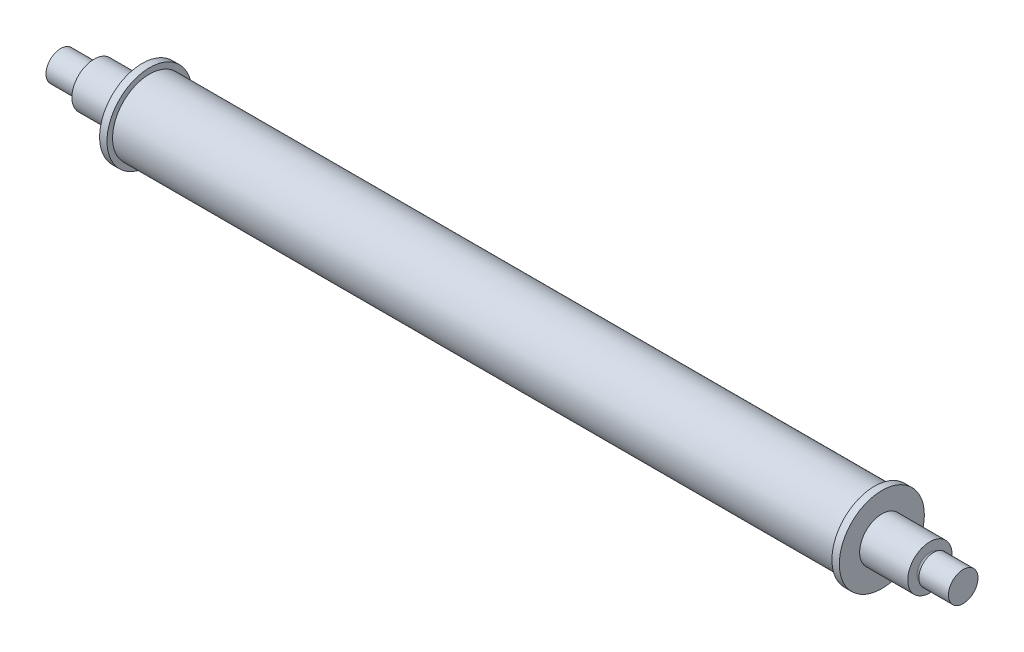
ISO-10303-21;
HEADER;
FILE_DESCRIPTION(('STEP AP214'),'2;1');
FILE_NAME('part.step','',(''),(''),'','','');
FILE_SCHEMA(('AUTOMOTIVE_DESIGN { 1 0 10303 214 1 1 1 1 }'));
ENDSEC;
DATA;
#1=APPLICATION_CONTEXT('core data for automotive mechanical design processes');
#2=APPLICATION_PROTOCOL_DEFINITION('international standard','automotive_design',2000,#1);
#3=PRODUCT_CONTEXT('',#1,'mechanical');
#4=PRODUCT('Part','Part','',(#3));
#5=PRODUCT_RELATED_PRODUCT_CATEGORY('part','',(#4));
#6=PRODUCT_DEFINITION_FORMATION('','',#4);
#7=PRODUCT_DEFINITION_CONTEXT('part definition',#1,'design');
#8=PRODUCT_DEFINITION('design','',#6,#7);
#9=PRODUCT_DEFINITION_SHAPE('','',#8);
#10=(LENGTH_UNIT() NAMED_UNIT(*) SI_UNIT(.MILLI.,.METRE.));
#11=(NAMED_UNIT(*) PLANE_ANGLE_UNIT() SI_UNIT($,.RADIAN.));
#12=(NAMED_UNIT(*) SI_UNIT($,.STERADIAN.) SOLID_ANGLE_UNIT());
#13=UNCERTAINTY_MEASURE_WITH_UNIT(LENGTH_MEASURE(1.E-05),#10,'distance_accuracy_value','');
#14=(GEOMETRIC_REPRESENTATION_CONTEXT(3) GLOBAL_UNCERTAINTY_ASSIGNED_CONTEXT((#13)) GLOBAL_UNIT_ASSIGNED_CONTEXT((#10,
#11,#12)) REPRESENTATION_CONTEXT('',''));
#15=CARTESIAN_POINT('',(0.,0.,0.));
#16=DIRECTION('',(0.,0.,1.));
#17=DIRECTION('',(1.,0.,0.));
#18=AXIS2_PLACEMENT_3D('',#15,#16,#17);
#19=CARTESIAN_POINT('',(-122.,0.,0.));
#20=DIRECTION('',(1.,0.,0.));
#21=DIRECTION('',(0.,0.,-1.));
#22=AXIS2_PLACEMENT_3D('',#19,#20,#21);
#23=CYLINDRICAL_SURFACE('',#22,4.);
#24=CARTESIAN_POINT('',(-122.,0.,0.));
#25=DIRECTION('',(1.,0.,0.));
#26=DIRECTION('',(0.,0.,-1.));
#27=AXIS2_PLACEMENT_3D('',#24,#25,#26);
#28=CIRCLE('',#27,4.);
#29=CARTESIAN_POINT('',(-122.,0.,-4.));
#30=VERTEX_POINT('',#29);
#31=EDGE_CURVE('E95',#30,#30,#28,.T.);
#32=ORIENTED_EDGE('',*,*,#31,.T.);
#33=EDGE_LOOP('',(#32));
#34=FACE_BOUND('',#33,.T.);
#35=CARTESIAN_POINT('',(-114.,0.,0.));
#36=DIRECTION('',(1.,0.,0.));
#37=DIRECTION('',(0.,0.,-1.));
#38=AXIS2_PLACEMENT_3D('',#35,#36,#37);
#39=CIRCLE('',#38,4.);
#40=CARTESIAN_POINT('',(-114.,0.,-4.));
#41=VERTEX_POINT('',#40);
#42=EDGE_CURVE('E10',#41,#41,#39,.T.);
#43=ORIENTED_EDGE('',*,*,#42,.F.);
#44=EDGE_LOOP('',(#43));
#45=FACE_BOUND('',#44,.T.);
#46=ADVANCED_FACE('F37',(#34,#45),#23,.T.);
#47=CARTESIAN_POINT('',(-114.,3.5,0.));
#48=DIRECTION('',(1.,0.,0.));
#49=DIRECTION('',(0.,0.,-1.));
#50=AXIS2_PLACEMENT_3D('',#47,#48,#49);
#51=PLANE('',#50);
#52=ORIENTED_EDGE('',*,*,#42,.T.);
#53=EDGE_LOOP('',(#52));
#54=FACE_BOUND('',#53,.T.);
#55=CARTESIAN_POINT('',(-114.,0.,0.));
#56=DIRECTION('',(1.,0.,0.));
#57=DIRECTION('',(0.,0.,-1.));
#58=AXIS2_PLACEMENT_3D('',#55,#56,#57);
#59=CIRCLE('',#58,3.5);
#60=CARTESIAN_POINT('',(-114.,0.,-3.5));
#61=VERTEX_POINT('',#60);
#62=EDGE_CURVE('E43',#61,#61,#59,.T.);
#63=ORIENTED_EDGE('',*,*,#62,.F.);
#64=EDGE_LOOP('',(#63));
#65=FACE_BOUND('',#64,.T.);
#66=ADVANCED_FACE('F112',(#54,#65),#51,.T.);
#67=CARTESIAN_POINT('',(-113.5,0.,0.));
#68=DIRECTION('',(1.,0.,0.));
#69=DIRECTION('',(0.,0.,-1.));
#70=AXIS2_PLACEMENT_3D('',#67,#68,#69);
#71=TOROIDAL_SURFACE('',#70,3.5,0.5);
#72=ORIENTED_EDGE('',*,*,#62,.T.);
#73=EDGE_LOOP('',(#72));
#74=FACE_BOUND('',#73,.T.);
#75=CARTESIAN_POINT('',(-113.,0.,0.));
#76=DIRECTION('',(1.,0.,0.));
#77=DIRECTION('',(0.,0.,-1.));
#78=AXIS2_PLACEMENT_3D('',#75,#76,#77);
#79=CIRCLE('',#78,3.5);
#80=CARTESIAN_POINT('',(-113.,0.,-3.5));
#81=VERTEX_POINT('',#80);
#82=EDGE_CURVE('E47',#81,#81,#79,.T.);
#83=ORIENTED_EDGE('',*,*,#82,.F.);
#84=EDGE_LOOP('',(#83));
#85=FACE_BOUND('',#84,.T.);
#86=ADVANCED_FACE('F116',(#74,#85),#71,.F.);
#87=CARTESIAN_POINT('',(-113.,6.,0.));
#88=DIRECTION('',(-1.,0.,0.));
#89=DIRECTION('',(0.,0.,1.));
#90=AXIS2_PLACEMENT_3D('',#87,#88,#89);
#91=PLANE('',#90);
#92=ORIENTED_EDGE('',*,*,#82,.T.);
#93=EDGE_LOOP('',(#92));
#94=FACE_BOUND('',#93,.T.);
#95=CARTESIAN_POINT('',(-113.,0.,0.));
#96=DIRECTION('',(1.,0.,0.));
#97=DIRECTION('',(0.,0.,-1.));
#98=AXIS2_PLACEMENT_3D('',#95,#96,#97);
#99=CIRCLE('',#98,6.);
#100=CARTESIAN_POINT('',(-113.,0.,-6.));
#101=VERTEX_POINT('',#100);
#102=EDGE_CURVE('E51',#101,#101,#99,.T.);
#103=ORIENTED_EDGE('',*,*,#102,.F.);
#104=EDGE_LOOP('',(#103));
#105=FACE_BOUND('',#104,.T.);
#106=ADVANCED_FACE('F120',(#94,#105),#91,.T.);
#107=CARTESIAN_POINT('',(-122.,0.,0.));
#108=DIRECTION('',(1.,0.,0.));
#109=DIRECTION('',(0.,0.,-1.));
#110=AXIS2_PLACEMENT_3D('',#107,#108,#109);
#111=CYLINDRICAL_SURFACE('',#110,6.);
#112=ORIENTED_EDGE('',*,*,#102,.T.);
#113=EDGE_LOOP('',(#112));
#114=FACE_BOUND('',#113,.T.);
#115=CARTESIAN_POINT('',(-100.,0.,0.));
#116=DIRECTION('',(1.,0.,0.));
#117=DIRECTION('',(0.,0.,-1.));
#118=AXIS2_PLACEMENT_3D('',#115,#116,#117);
#119=CIRCLE('',#118,6.);
#120=CARTESIAN_POINT('',(-100.,0.,-6.));
#121=VERTEX_POINT('',#120);
#122=EDGE_CURVE('E56',#121,#121,#119,.T.);
#123=ORIENTED_EDGE('',*,*,#122,.F.);
#124=EDGE_LOOP('',(#123));
#125=FACE_BOUND('',#124,.T.);
#126=ADVANCED_FACE('F126',(#114,#125),#111,.T.);
#127=CARTESIAN_POINT('',(-100.,11.5,0.));
#128=DIRECTION('',(-1.,0.,0.));
#129=DIRECTION('',(0.,0.,1.));
#130=AXIS2_PLACEMENT_3D('',#127,#128,#129);
#131=PLANE('',#130);
#132=ORIENTED_EDGE('',*,*,#122,.T.);
#133=EDGE_LOOP('',(#132));
#134=FACE_BOUND('',#133,.T.);
#135=CARTESIAN_POINT('',(-100.,0.,0.));
#136=DIRECTION('',(1.,0.,0.));
#137=DIRECTION('',(0.,0.,-1.));
#138=AXIS2_PLACEMENT_3D('',#135,#136,#137);
#139=CIRCLE('',#138,11.5);
#140=CARTESIAN_POINT('',(-100.,0.,-11.5));
#141=VERTEX_POINT('',#140);
#142=EDGE_CURVE('E59',#141,#141,#139,.T.);
#143=ORIENTED_EDGE('',*,*,#142,.F.);
#144=EDGE_LOOP('',(#143));
#145=FACE_BOUND('',#144,.T.);
#146=ADVANCED_FACE('F130',(#134,#145),#131,.T.);
#147=CARTESIAN_POINT('',(-122.,0.,0.));
#148=DIRECTION('',(1.,0.,0.));
#149=DIRECTION('',(0.,0.,-1.));
#150=AXIS2_PLACEMENT_3D('',#147,#148,#149);
#151=CYLINDRICAL_SURFACE('',#150,11.5);
#152=ORIENTED_EDGE('',*,*,#142,.T.);
#153=EDGE_LOOP('',(#152));
#154=FACE_BOUND('',#153,.T.);
#155=CARTESIAN_POINT('',(-98.,0.,0.));
#156=DIRECTION('',(1.,0.,0.));
#157=DIRECTION('',(0.,0.,-1.));
#158=AXIS2_PLACEMENT_3D('',#155,#156,#157);
#159=CIRCLE('',#158,11.5);
#160=CARTESIAN_POINT('',(-98.,0.,-11.5));
#161=VERTEX_POINT('',#160);
#162=EDGE_CURVE('E62',#161,#161,#159,.T.);
#163=ORIENTED_EDGE('',*,*,#162,.F.);
#164=EDGE_LOOP('',(#163));
#165=FACE_BOUND('',#164,.T.);
#166=ADVANCED_FACE('F134',(#154,#165),#151,.T.);
#167=CARTESIAN_POINT('',(-98.,10.,0.));
#168=DIRECTION('',(1.,0.,0.));
#169=DIRECTION('',(0.,0.,-1.));
#170=AXIS2_PLACEMENT_3D('',#167,#168,#169);
#171=PLANE('',#170);
#172=ORIENTED_EDGE('',*,*,#162,.T.);
#173=EDGE_LOOP('',(#172));
#174=FACE_BOUND('',#173,.T.);
#175=CARTESIAN_POINT('',(-98.,0.,0.));
#176=DIRECTION('',(1.,0.,0.));
#177=DIRECTION('',(0.,0.,-1.));
#178=AXIS2_PLACEMENT_3D('',#175,#176,#177);
#179=CIRCLE('',#178,10.);
#180=CARTESIAN_POINT('',(-98.,0.,-10.));
#181=VERTEX_POINT('',#180);
#182=EDGE_CURVE('E65',#181,#181,#179,.T.);
#183=ORIENTED_EDGE('',*,*,#182,.F.);
#184=EDGE_LOOP('',(#183));
#185=FACE_BOUND('',#184,.T.);
#186=ADVANCED_FACE('F138',(#174,#185),#171,.T.);
#187=CARTESIAN_POINT('',(-122.,0.,0.));
#188=DIRECTION('',(1.,0.,0.));
#189=DIRECTION('',(0.,0.,-1.));
#190=AXIS2_PLACEMENT_3D('',#187,#188,#189);
#191=CYLINDRICAL_SURFACE('',#190,10.);
#192=ORIENTED_EDGE('',*,*,#182,.T.);
#193=EDGE_LOOP('',(#192));
#194=FACE_BOUND('',#193,.T.);
#195=CARTESIAN_POINT('',(98.,0.,0.));
#196=DIRECTION('',(1.,0.,0.));
#197=DIRECTION('',(0.,0.,-1.));
#198=AXIS2_PLACEMENT_3D('',#195,#196,#197);
#199=CIRCLE('',#198,10.);
#200=CARTESIAN_POINT('',(98.,0.,-10.));
#201=VERTEX_POINT('',#200);
#202=EDGE_CURVE('E68',#201,#201,#199,.T.);
#203=ORIENTED_EDGE('',*,*,#202,.F.);
#204=EDGE_LOOP('',(#203));
#205=FACE_BOUND('',#204,.T.);
#206=ADVANCED_FACE('F142',(#194,#205),#191,.T.);
#207=CARTESIAN_POINT('',(98.,11.5,0.));
#208=DIRECTION('',(-1.,0.,0.));
#209=DIRECTION('',(0.,0.,1.));
#210=AXIS2_PLACEMENT_3D('',#207,#208,#209);
#211=PLANE('',#210);
#212=ORIENTED_EDGE('',*,*,#202,.T.);
#213=EDGE_LOOP('',(#212));
#214=FACE_BOUND('',#213,.T.);
#215=CARTESIAN_POINT('',(98.,0.,0.));
#216=DIRECTION('',(1.,0.,0.));
#217=DIRECTION('',(0.,0.,-1.));
#218=AXIS2_PLACEMENT_3D('',#215,#216,#217);
#219=CIRCLE('',#218,11.5);
#220=CARTESIAN_POINT('',(98.,0.,-11.5));
#221=VERTEX_POINT('',#220);
#222=EDGE_CURVE('E71',#221,#221,#219,.T.);
#223=ORIENTED_EDGE('',*,*,#222,.F.);
#224=EDGE_LOOP('',(#223));
#225=FACE_BOUND('',#224,.T.);
#226=ADVANCED_FACE('F146',(#214,#225),#211,.T.);
#227=CARTESIAN_POINT('',(-122.,0.,0.));
#228=DIRECTION('',(1.,0.,0.));
#229=DIRECTION('',(0.,0.,-1.));
#230=AXIS2_PLACEMENT_3D('',#227,#228,#229);
#231=CYLINDRICAL_SURFACE('',#230,11.5);
#232=ORIENTED_EDGE('',*,*,#222,.T.);
#233=EDGE_LOOP('',(#232));
#234=FACE_BOUND('',#233,.T.);
#235=CARTESIAN_POINT('',(100.,0.,0.));
#236=DIRECTION('',(1.,0.,0.));
#237=DIRECTION('',(0.,0.,-1.));
#238=AXIS2_PLACEMENT_3D('',#235,#236,#237);
#239=CIRCLE('',#238,11.5);
#240=CARTESIAN_POINT('',(100.,0.,-11.5));
#241=VERTEX_POINT('',#240);
#242=EDGE_CURVE('E74',#241,#241,#239,.T.);
#243=ORIENTED_EDGE('',*,*,#242,.F.);
#244=EDGE_LOOP('',(#243));
#245=FACE_BOUND('',#244,.T.);
#246=ADVANCED_FACE('F150',(#234,#245),#231,.T.);
#247=CARTESIAN_POINT('',(100.,6.,0.));
#248=DIRECTION('',(1.,0.,0.));
#249=DIRECTION('',(0.,0.,-1.));
#250=AXIS2_PLACEMENT_3D('',#247,#248,#249);
#251=PLANE('',#250);
#252=ORIENTED_EDGE('',*,*,#242,.T.);
#253=EDGE_LOOP('',(#252));
#254=FACE_BOUND('',#253,.T.);
#255=CARTESIAN_POINT('',(100.,0.,0.));
#256=DIRECTION('',(1.,0.,0.));
#257=DIRECTION('',(0.,0.,-1.));
#258=AXIS2_PLACEMENT_3D('',#255,#256,#257);
#259=CIRCLE('',#258,6.);
#260=CARTESIAN_POINT('',(100.,0.,-6.));
#261=VERTEX_POINT('',#260);
#262=EDGE_CURVE('E77',#261,#261,#259,.T.);
#263=ORIENTED_EDGE('',*,*,#262,.F.);
#264=EDGE_LOOP('',(#263));
#265=FACE_BOUND('',#264,.T.);
#266=ADVANCED_FACE('F154',(#254,#265),#251,.T.);
#267=CARTESIAN_POINT('',(-122.,0.,0.));
#268=DIRECTION('',(1.,0.,0.));
#269=DIRECTION('',(0.,0.,-1.));
#270=AXIS2_PLACEMENT_3D('',#267,#268,#269);
#271=CYLINDRICAL_SURFACE('',#270,6.);
#272=ORIENTED_EDGE('',*,*,#262,.T.);
#273=EDGE_LOOP('',(#272));
#274=FACE_BOUND('',#273,.T.);
#275=CARTESIAN_POINT('',(113.,0.,0.));
#276=DIRECTION('',(1.,0.,0.));
#277=DIRECTION('',(0.,0.,-1.));
#278=AXIS2_PLACEMENT_3D('',#275,#276,#277);
#279=CIRCLE('',#278,6.);
#280=CARTESIAN_POINT('',(113.,0.,-6.));
#281=VERTEX_POINT('',#280);
#282=EDGE_CURVE('E80',#281,#281,#279,.T.);
#283=ORIENTED_EDGE('',*,*,#282,.F.);
#284=EDGE_LOOP('',(#283));
#285=FACE_BOUND('',#284,.T.);
#286=ADVANCED_FACE('F158',(#274,#285),#271,.T.);
#287=CARTESIAN_POINT('',(113.,3.5,0.));
#288=DIRECTION('',(1.,0.,0.));
#289=DIRECTION('',(0.,0.,-1.));
#290=AXIS2_PLACEMENT_3D('',#287,#288,#289);
#291=PLANE('',#290);
#292=ORIENTED_EDGE('',*,*,#282,.T.);
#293=EDGE_LOOP('',(#292));
#294=FACE_BOUND('',#293,.T.);
#295=CARTESIAN_POINT('',(113.,0.,0.));
#296=DIRECTION('',(1.,0.,0.));
#297=DIRECTION('',(0.,0.,-1.));
#298=AXIS2_PLACEMENT_3D('',#295,#296,#297);
#299=CIRCLE('',#298,3.5);
#300=CARTESIAN_POINT('',(113.,0.,-3.5));
#301=VERTEX_POINT('',#300);
#302=EDGE_CURVE('E83',#301,#301,#299,.T.);
#303=ORIENTED_EDGE('',*,*,#302,.F.);
#304=EDGE_LOOP('',(#303));
#305=FACE_BOUND('',#304,.T.);
#306=ADVANCED_FACE('F162',(#294,#305),#291,.T.);
#307=CARTESIAN_POINT('',(113.5,0.,0.));
#308=DIRECTION('',(1.,0.,0.));
#309=DIRECTION('',(0.,0.,-1.));
#310=AXIS2_PLACEMENT_3D('',#307,#308,#309);
#311=TOROIDAL_SURFACE('',#310,3.5,0.5);
#312=ORIENTED_EDGE('',*,*,#302,.T.);
#313=EDGE_LOOP('',(#312));
#314=FACE_BOUND('',#313,.T.);
#315=CARTESIAN_POINT('',(114.,0.,0.));
#316=DIRECTION('',(1.,0.,0.));
#317=DIRECTION('',(0.,0.,-1.));
#318=AXIS2_PLACEMENT_3D('',#315,#316,#317);
#319=CIRCLE('',#318,3.5);
#320=CARTESIAN_POINT('',(114.,0.,-3.5));
#321=VERTEX_POINT('',#320);
#322=EDGE_CURVE('E86',#321,#321,#319,.T.);
#323=ORIENTED_EDGE('',*,*,#322,.F.);
#324=EDGE_LOOP('',(#323));
#325=FACE_BOUND('',#324,.T.);
#326=ADVANCED_FACE('F166',(#314,#325),#311,.F.);
#327=CARTESIAN_POINT('',(114.,4.,0.));
#328=DIRECTION('',(-1.,0.,0.));
#329=DIRECTION('',(0.,0.,1.));
#330=AXIS2_PLACEMENT_3D('',#327,#328,#329);
#331=PLANE('',#330);
#332=ORIENTED_EDGE('',*,*,#322,.T.);
#333=EDGE_LOOP('',(#332));
#334=FACE_BOUND('',#333,.T.);
#335=CARTESIAN_POINT('',(114.,0.,0.));
#336=DIRECTION('',(1.,0.,0.));
#337=DIRECTION('',(0.,0.,-1.));
#338=AXIS2_PLACEMENT_3D('',#335,#336,#337);
#339=CIRCLE('',#338,4.);
#340=CARTESIAN_POINT('',(114.,0.,-4.));
#341=VERTEX_POINT('',#340);
#342=EDGE_CURVE('E89',#341,#341,#339,.T.);
#343=ORIENTED_EDGE('',*,*,#342,.F.);
#344=EDGE_LOOP('',(#343));
#345=FACE_BOUND('',#344,.T.);
#346=ADVANCED_FACE('F170',(#334,#345),#331,.T.);
#347=CARTESIAN_POINT('',(-122.,0.,0.));
#348=DIRECTION('',(1.,0.,0.));
#349=DIRECTION('',(0.,0.,-1.));
#350=AXIS2_PLACEMENT_3D('',#347,#348,#349);
#351=CYLINDRICAL_SURFACE('',#350,4.);
#352=ORIENTED_EDGE('',*,*,#342,.T.);
#353=EDGE_LOOP('',(#352));
#354=FACE_BOUND('',#353,.T.);
#355=CARTESIAN_POINT('',(122.,0.,0.));
#356=DIRECTION('',(1.,0.,0.));
#357=DIRECTION('',(0.,0.,-1.));
#358=AXIS2_PLACEMENT_3D('',#355,#356,#357);
#359=CIRCLE('',#358,4.);
#360=CARTESIAN_POINT('',(122.,0.,-4.));
#361=VERTEX_POINT('',#360);
#362=EDGE_CURVE('E92',#361,#361,#359,.T.);
#363=ORIENTED_EDGE('',*,*,#362,.F.);
#364=EDGE_LOOP('',(#363));
#365=FACE_BOUND('',#364,.T.);
#366=ADVANCED_FACE('F108',(#354,#365),#351,.T.);
#367=CARTESIAN_POINT('',(122.,0.,0.));
#368=DIRECTION('',(1.,0.,0.));
#369=DIRECTION('',(0.,0.,-1.));
#370=AXIS2_PLACEMENT_3D('',#367,#368,#369);
#371=PLANE('',#370);
#372=ORIENTED_EDGE('',*,*,#362,.T.);
#373=EDGE_LOOP('',(#372));
#374=FACE_BOUND('',#373,.T.);
#375=ADVANCED_FACE('F103',(#374),#371,.T.);
#376=CARTESIAN_POINT('',(-122.,4.,0.));
#377=DIRECTION('',(-1.,0.,0.));
#378=DIRECTION('',(0.,0.,1.));
#379=AXIS2_PLACEMENT_3D('',#376,#377,#378);
#380=PLANE('',#379);
#381=ORIENTED_EDGE('',*,*,#31,.F.);
#382=EDGE_LOOP('',(#381));
#383=FACE_BOUND('',#382,.T.);
#384=ADVANCED_FACE('F101',(#383),#380,.T.);
#385=CLOSED_SHELL('',(#46,#66,#86,#106,#126,#146,#166,#186,#206,#226,#246,#266,#286,#306,#326,
#346,#366,#375,#384));
#386=MANIFOLD_SOLID_BREP('B2',#385);
#387=ADVANCED_BREP_SHAPE_REPRESENTATION('',(#18,#386),#14);
#388=SHAPE_DEFINITION_REPRESENTATION(#9,#387);
ENDSEC;
END-ISO-10303-21;
